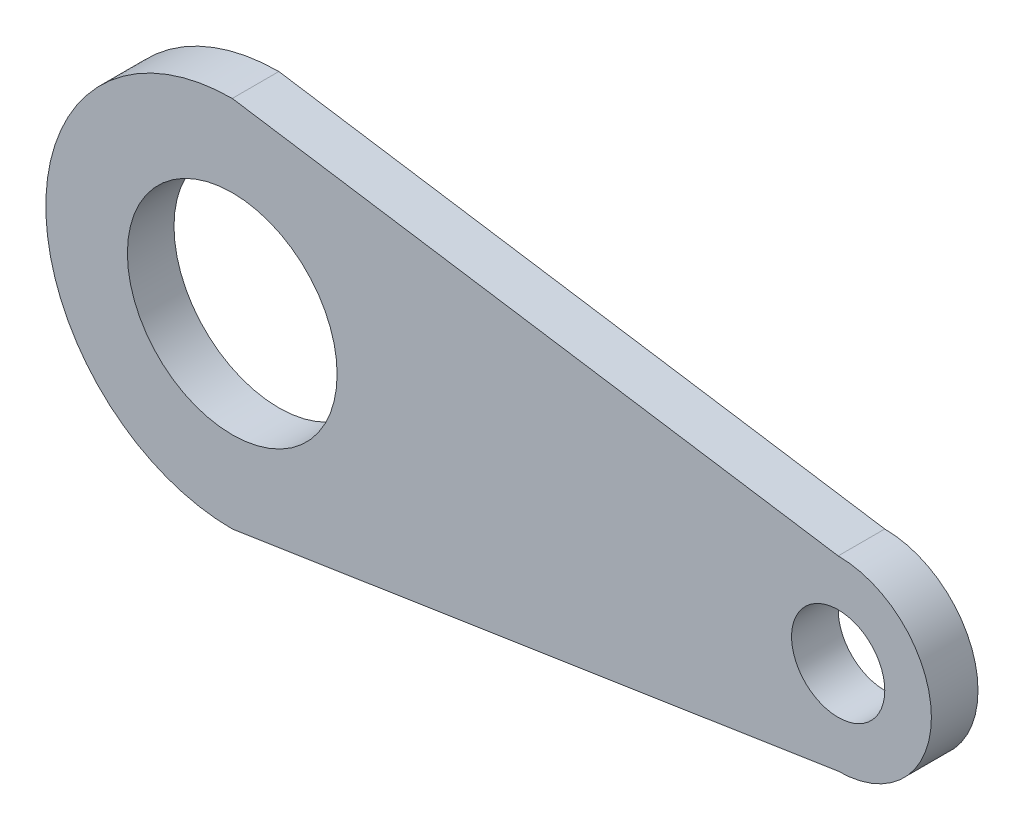
ISO-10303-21;
HEADER;
FILE_DESCRIPTION(('STEP AP214'),'2;1');
FILE_NAME('part.step','',(''),(''),'','','');
FILE_SCHEMA(('AUTOMOTIVE_DESIGN { 1 0 10303 214 1 1 1 1 }'));
ENDSEC;
DATA;
#1=APPLICATION_CONTEXT('core data for automotive mechanical design processes');
#2=APPLICATION_PROTOCOL_DEFINITION('international standard','automotive_design',2000,#1);
#3=PRODUCT_CONTEXT('',#1,'mechanical');
#4=PRODUCT('Part','Part','',(#3));
#5=PRODUCT_RELATED_PRODUCT_CATEGORY('part','',(#4));
#6=PRODUCT_DEFINITION_FORMATION('','',#4);
#7=PRODUCT_DEFINITION_CONTEXT('part definition',#1,'design');
#8=PRODUCT_DEFINITION('design','',#6,#7);
#9=PRODUCT_DEFINITION_SHAPE('','',#8);
#10=(LENGTH_UNIT() NAMED_UNIT(*) SI_UNIT(.MILLI.,.METRE.));
#11=(NAMED_UNIT(*) PLANE_ANGLE_UNIT() SI_UNIT($,.RADIAN.));
#12=(NAMED_UNIT(*) SI_UNIT($,.STERADIAN.) SOLID_ANGLE_UNIT());
#13=UNCERTAINTY_MEASURE_WITH_UNIT(LENGTH_MEASURE(1.E-05),#10,'distance_accuracy_value','');
#14=(GEOMETRIC_REPRESENTATION_CONTEXT(3) GLOBAL_UNCERTAINTY_ASSIGNED_CONTEXT((#13)) GLOBAL_UNIT_ASSIGNED_CONTEXT((#10,
#11,#12)) REPRESENTATION_CONTEXT('',''));
#15=CARTESIAN_POINT('',(0.,0.,0.));
#16=DIRECTION('',(0.,0.,1.));
#17=DIRECTION('',(1.,0.,0.));
#18=AXIS2_PLACEMENT_3D('',#15,#16,#17);
#19=CARTESIAN_POINT('',(-107.748780518687,0.,10.));
#20=DIRECTION('',(0.,0.,1.));
#21=DIRECTION('',(1.,0.,0.));
#22=AXIS2_PLACEMENT_3D('',#19,#20,#21);
#23=PLANE('',#22);
#24=CARTESIAN_POINT('',(-107.748780518687,0.,10.));
#25=DIRECTION('',(0.,0.,1.));
#26=DIRECTION('',(1.,0.,0.));
#27=AXIS2_PLACEMENT_3D('',#24,#25,#26);
#28=CIRCLE('',#27,22.5);
#29=CARTESIAN_POINT('',(-85.2487805186865,0.,10.));
#30=VERTEX_POINT('',#29);
#31=EDGE_CURVE('E116',#30,#30,#28,.T.);
#32=ORIENTED_EDGE('',*,*,#31,.F.);
#33=EDGE_LOOP('',(#32));
#34=FACE_BOUND('',#33,.T.);
#35=CARTESIAN_POINT('',(-107.748780518687,0.,10.));
#36=DIRECTION('',(0.,0.,1.));
#37=DIRECTION('',(1.,0.,0.));
#38=AXIS2_PLACEMENT_3D('',#35,#36,#37);
#39=CIRCLE('',#38,40.);
#40=CARTESIAN_POINT('',(-107.748780518687,40.,10.));
#41=VERTEX_POINT('',#40);
#42=CARTESIAN_POINT('',(-107.748780518687,-40.,10.));
#43=VERTEX_POINT('',#42);
#44=EDGE_CURVE('E96',#41,#43,#39,.T.);
#45=ORIENTED_EDGE('',*,*,#44,.T.);
#46=DIRECTION('',(0.988371697650617,0.152057184253941,0.));
#47=VECTOR('',#46,1.);
#48=CARTESIAN_POINT('',(-107.748780518687,-40.,10.));
#49=LINE('',#48,#47);
#50=CARTESIAN_POINT('',(22.2512194813135,-20.,10.));
#51=VERTEX_POINT('',#50);
#52=EDGE_CURVE('E91',#43,#51,#49,.T.);
#53=ORIENTED_EDGE('',*,*,#52,.T.);
#54=CARTESIAN_POINT('',(22.2512194813135,0.,10.));
#55=DIRECTION('',(0.,0.,1.));
#56=DIRECTION('',(1.,0.,0.));
#57=AXIS2_PLACEMENT_3D('',#54,#55,#56);
#58=CIRCLE('',#57,20.);
#59=CARTESIAN_POINT('',(22.2512194813135,20.,10.));
#60=VERTEX_POINT('',#59);
#61=EDGE_CURVE('E94',#51,#60,#58,.T.);
#62=ORIENTED_EDGE('',*,*,#61,.T.);
#63=DIRECTION('',(-0.988371697650617,0.152057184253941,0.));
#64=VECTOR('',#63,1.);
#65=CARTESIAN_POINT('',(-107.748780518687,40.,10.));
#66=LINE('',#65,#64);
#67=EDGE_CURVE('E61',#60,#41,#66,.T.);
#68=ORIENTED_EDGE('',*,*,#67,.T.);
#69=EDGE_LOOP('',(#45,#53,#62,#68));
#70=FACE_BOUND('',#69,.T.);
#71=CARTESIAN_POINT('',(22.2512194813135,0.,10.));
#72=DIRECTION('',(0.,0.,1.));
#73=DIRECTION('',(1.,0.,0.));
#74=AXIS2_PLACEMENT_3D('',#71,#72,#73);
#75=CIRCLE('',#74,10.);
#76=CARTESIAN_POINT('',(32.2512194813135,0.,10.));
#77=VERTEX_POINT('',#76);
#78=EDGE_CURVE('E138',#77,#77,#75,.T.);
#79=ORIENTED_EDGE('',*,*,#78,.F.);
#80=EDGE_LOOP('',(#79));
#81=FACE_BOUND('',#80,.T.);
#82=ADVANCED_FACE('F43',(#34,#70,#81),#23,.T.);
#83=CARTESIAN_POINT('',(-107.748780518687,0.,0.));
#84=DIRECTION('',(0.,0.,1.));
#85=DIRECTION('',(1.,0.,0.));
#86=AXIS2_PLACEMENT_3D('',#83,#84,#85);
#87=PLANE('',#86);
#88=CARTESIAN_POINT('',(-107.748780518687,0.,0.));
#89=DIRECTION('',(0.,0.,1.));
#90=DIRECTION('',(1.,0.,0.));
#91=AXIS2_PLACEMENT_3D('',#88,#89,#90);
#92=CIRCLE('',#91,40.);
#93=CARTESIAN_POINT('',(-107.748780518687,40.,0.));
#94=VERTEX_POINT('',#93);
#95=CARTESIAN_POINT('',(-107.748780518687,-40.,0.));
#96=VERTEX_POINT('',#95);
#97=EDGE_CURVE('E112',#94,#96,#92,.T.);
#98=ORIENTED_EDGE('',*,*,#97,.F.);
#99=DIRECTION('',(-0.988371697650617,0.152057184253941,0.));
#100=VECTOR('',#99,1.);
#101=CARTESIAN_POINT('',(-107.748780518687,40.,0.));
#102=LINE('',#101,#100);
#103=CARTESIAN_POINT('',(22.2512194813135,20.,0.));
#104=VERTEX_POINT('',#103);
#105=EDGE_CURVE('E84',#104,#94,#102,.T.);
#106=ORIENTED_EDGE('',*,*,#105,.F.);
#107=CARTESIAN_POINT('',(22.2512194813135,0.,0.));
#108=DIRECTION('',(0.,0.,1.));
#109=DIRECTION('',(1.,0.,0.));
#110=AXIS2_PLACEMENT_3D('',#107,#108,#109);
#111=CIRCLE('',#110,20.);
#112=CARTESIAN_POINT('',(22.2512194813135,-20.,0.));
#113=VERTEX_POINT('',#112);
#114=EDGE_CURVE('E78',#113,#104,#111,.T.);
#115=ORIENTED_EDGE('',*,*,#114,.F.);
#116=DIRECTION('',(0.988371697650617,0.152057184253941,0.));
#117=VECTOR('',#116,1.);
#118=CARTESIAN_POINT('',(-107.748780518687,-40.,0.));
#119=LINE('',#118,#117);
#120=EDGE_CURVE('E101',#96,#113,#119,.T.);
#121=ORIENTED_EDGE('',*,*,#120,.F.);
#122=EDGE_LOOP('',(#98,#106,#115,#121));
#123=FACE_BOUND('',#122,.T.);
#124=CARTESIAN_POINT('',(-107.748780518687,0.,0.));
#125=DIRECTION('',(0.,0.,1.));
#126=DIRECTION('',(1.,0.,0.));
#127=AXIS2_PLACEMENT_3D('',#124,#125,#126);
#128=CIRCLE('',#127,22.5);
#129=CARTESIAN_POINT('',(-85.2487805186865,0.,0.));
#130=VERTEX_POINT('',#129);
#131=EDGE_CURVE('E134',#130,#130,#128,.T.);
#132=ORIENTED_EDGE('',*,*,#131,.T.);
#133=EDGE_LOOP('',(#132));
#134=FACE_BOUND('',#133,.T.);
#135=CARTESIAN_POINT('',(22.2512194813135,0.,0.));
#136=DIRECTION('',(0.,0.,1.));
#137=DIRECTION('',(1.,0.,0.));
#138=AXIS2_PLACEMENT_3D('',#135,#136,#137);
#139=CIRCLE('',#138,10.);
#140=CARTESIAN_POINT('',(32.2512194813135,0.,0.));
#141=VERTEX_POINT('',#140);
#142=EDGE_CURVE('E142',#141,#141,#139,.T.);
#143=ORIENTED_EDGE('',*,*,#142,.T.);
#144=EDGE_LOOP('',(#143));
#145=FACE_BOUND('',#144,.T.);
#146=ADVANCED_FACE('F129',(#123,#134,#145),#87,.F.);
#147=CARTESIAN_POINT('',(-107.748780518687,0.,10.));
#148=DIRECTION('',(0.,0.,-1.));
#149=DIRECTION('',(-1.,0.,0.));
#150=AXIS2_PLACEMENT_3D('',#147,#148,#149);
#151=CYLINDRICAL_SURFACE('',#150,40.);
#152=ORIENTED_EDGE('',*,*,#97,.T.);
#153=DIRECTION('',(0.,0.,-1.));
#154=VECTOR('',#153,1.);
#155=CARTESIAN_POINT('',(-107.748780518687,-40.,10.));
#156=LINE('',#155,#154);
#157=EDGE_CURVE('E11',#43,#96,#156,.T.);
#158=ORIENTED_EDGE('',*,*,#157,.F.);
#159=ORIENTED_EDGE('',*,*,#44,.F.);
#160=DIRECTION('',(0.,0.,-1.));
#161=VECTOR('',#160,1.);
#162=CARTESIAN_POINT('',(-107.748780518687,40.,10.));
#163=LINE('',#162,#161);
#164=EDGE_CURVE('E108',#41,#94,#163,.T.);
#165=ORIENTED_EDGE('',*,*,#164,.T.);
#166=EDGE_LOOP('',(#152,#158,#159,#165));
#167=FACE_BOUND('',#166,.T.);
#168=ADVANCED_FACE('F45',(#167),#151,.T.);
#169=CARTESIAN_POINT('',(-107.748780518687,-40.,10.));
#170=DIRECTION('',(-0.152057184253941,0.988371697650617,0.));
#171=DIRECTION('',(-0.988371697650617,-0.152057184253941,0.));
#172=AXIS2_PLACEMENT_3D('',#169,#170,#171);
#173=PLANE('',#172);
#174=ORIENTED_EDGE('',*,*,#120,.T.);
#175=DIRECTION('',(0.,0.,-1.));
#176=VECTOR('',#175,1.);
#177=CARTESIAN_POINT('',(22.2512194813135,-20.,10.));
#178=LINE('',#177,#176);
#179=EDGE_CURVE('E53',#51,#113,#178,.T.);
#180=ORIENTED_EDGE('',*,*,#179,.F.);
#181=ORIENTED_EDGE('',*,*,#52,.F.);
#182=ORIENTED_EDGE('',*,*,#157,.T.);
#183=EDGE_LOOP('',(#174,#180,#181,#182));
#184=FACE_BOUND('',#183,.T.);
#185=ADVANCED_FACE('F100',(#184),#173,.F.);
#186=CARTESIAN_POINT('',(22.2512194813135,0.,10.));
#187=DIRECTION('',(0.,0.,-1.));
#188=DIRECTION('',(-1.,0.,0.));
#189=AXIS2_PLACEMENT_3D('',#186,#187,#188);
#190=CYLINDRICAL_SURFACE('',#189,20.);
#191=ORIENTED_EDGE('',*,*,#114,.T.);
#192=DIRECTION('',(0.,0.,-1.));
#193=VECTOR('',#192,1.);
#194=CARTESIAN_POINT('',(22.2512194813135,20.,10.));
#195=LINE('',#194,#193);
#196=EDGE_CURVE('E103',#60,#104,#195,.T.);
#197=ORIENTED_EDGE('',*,*,#196,.F.);
#198=ORIENTED_EDGE('',*,*,#61,.F.);
#199=ORIENTED_EDGE('',*,*,#179,.T.);
#200=EDGE_LOOP('',(#191,#197,#198,#199));
#201=FACE_BOUND('',#200,.T.);
#202=ADVANCED_FACE('F104',(#201),#190,.T.);
#203=CARTESIAN_POINT('',(-107.748780518687,40.,10.));
#204=DIRECTION('',(-0.152057184253941,-0.988371697650617,0.));
#205=DIRECTION('',(0.988371697650617,-0.152057184253941,0.));
#206=AXIS2_PLACEMENT_3D('',#203,#204,#205);
#207=PLANE('',#206);
#208=ORIENTED_EDGE('',*,*,#105,.T.);
#209=ORIENTED_EDGE('',*,*,#164,.F.);
#210=ORIENTED_EDGE('',*,*,#67,.F.);
#211=ORIENTED_EDGE('',*,*,#196,.T.);
#212=EDGE_LOOP('',(#208,#209,#210,#211));
#213=FACE_BOUND('',#212,.T.);
#214=ADVANCED_FACE('F126',(#213),#207,.F.);
#215=CARTESIAN_POINT('',(-107.748780518687,0.,10.));
#216=DIRECTION('',(0.,0.,-1.));
#217=DIRECTION('',(-1.,0.,0.));
#218=AXIS2_PLACEMENT_3D('',#215,#216,#217);
#219=CYLINDRICAL_SURFACE('',#218,22.5);
#220=ORIENTED_EDGE('',*,*,#31,.T.);
#221=EDGE_LOOP('',(#220));
#222=FACE_BOUND('',#221,.T.);
#223=ORIENTED_EDGE('',*,*,#131,.F.);
#224=EDGE_LOOP('',(#223));
#225=FACE_BOUND('',#224,.T.);
#226=ADVANCED_FACE('F161',(#222,#225),#219,.F.);
#227=CARTESIAN_POINT('',(22.2512194813135,0.,10.));
#228=DIRECTION('',(0.,0.,-1.));
#229=DIRECTION('',(-1.,0.,0.));
#230=AXIS2_PLACEMENT_3D('',#227,#228,#229);
#231=CYLINDRICAL_SURFACE('',#230,10.);
#232=ORIENTED_EDGE('',*,*,#78,.T.);
#233=EDGE_LOOP('',(#232));
#234=FACE_BOUND('',#233,.T.);
#235=ORIENTED_EDGE('',*,*,#142,.F.);
#236=EDGE_LOOP('',(#235));
#237=FACE_BOUND('',#236,.T.);
#238=ADVANCED_FACE('F150',(#234,#237),#231,.F.);
#239=CLOSED_SHELL('',(#82,#146,#168,#185,#202,#214,#226,#238));
#240=MANIFOLD_SOLID_BREP('B2',#239);
#241=ADVANCED_BREP_SHAPE_REPRESENTATION('',(#18,#240),#14);
#242=SHAPE_DEFINITION_REPRESENTATION(#9,#241);
ENDSEC;
END-ISO-10303-21;
